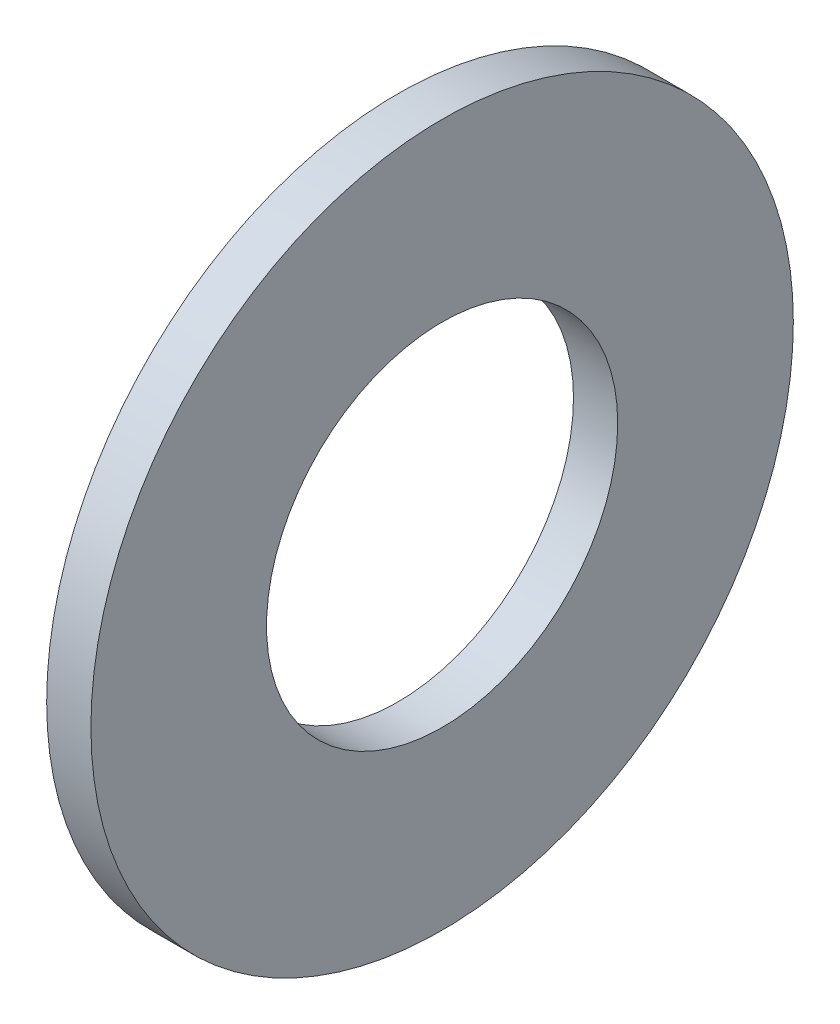
ISO-10303-21;
HEADER;
FILE_DESCRIPTION(('STEP AP214'),'2;1');
FILE_NAME('part.step','',(''),(''),'','','');
FILE_SCHEMA(('AUTOMOTIVE_DESIGN { 1 0 10303 214 1 1 1 1 }'));
ENDSEC;
DATA;
#1=APPLICATION_CONTEXT('core data for automotive mechanical design processes');
#2=APPLICATION_PROTOCOL_DEFINITION('international standard','automotive_design',2000,#1);
#3=PRODUCT_CONTEXT('',#1,'mechanical');
#4=PRODUCT('Part','Part','',(#3));
#5=PRODUCT_RELATED_PRODUCT_CATEGORY('part','',(#4));
#6=PRODUCT_DEFINITION_FORMATION('','',#4);
#7=PRODUCT_DEFINITION_CONTEXT('part definition',#1,'design');
#8=PRODUCT_DEFINITION('design','',#6,#7);
#9=PRODUCT_DEFINITION_SHAPE('','',#8);
#10=(LENGTH_UNIT() NAMED_UNIT(*) SI_UNIT(.MILLI.,.METRE.));
#11=(NAMED_UNIT(*) PLANE_ANGLE_UNIT() SI_UNIT($,.RADIAN.));
#12=(NAMED_UNIT(*) SI_UNIT($,.STERADIAN.) SOLID_ANGLE_UNIT());
#13=UNCERTAINTY_MEASURE_WITH_UNIT(LENGTH_MEASURE(1.E-05),#10,'distance_accuracy_value','');
#14=(GEOMETRIC_REPRESENTATION_CONTEXT(3) GLOBAL_UNCERTAINTY_ASSIGNED_CONTEXT((#13)) GLOBAL_UNIT_ASSIGNED_CONTEXT((#10,
#11,#12)) REPRESENTATION_CONTEXT('',''));
#15=CARTESIAN_POINT('',(0.,0.,0.));
#16=DIRECTION('',(0.,0.,1.));
#17=DIRECTION('',(1.,0.,0.));
#18=AXIS2_PLACEMENT_3D('',#15,#16,#17);
#19=CARTESIAN_POINT('',(0.8,0.,0.));
#20=DIRECTION('',(1.,0.,0.));
#21=DIRECTION('',(0.,0.,-1.));
#22=AXIS2_PLACEMENT_3D('',#19,#20,#21);
#23=PLANE('',#22);
#24=CARTESIAN_POINT('',(0.8,0.,0.));
#25=DIRECTION('',(1.,0.,0.));
#26=DIRECTION('',(0.,0.,-1.));
#27=AXIS2_PLACEMENT_3D('',#24,#25,#26);
#28=CIRCLE('',#27,6.35);
#29=CARTESIAN_POINT('',(0.8,0.,-6.35));
#30=VERTEX_POINT('',#29);
#31=EDGE_CURVE('E10',#30,#30,#28,.T.);
#32=ORIENTED_EDGE('',*,*,#31,.T.);
#33=EDGE_LOOP('',(#32));
#34=FACE_BOUND('',#33,.T.);
#35=CARTESIAN_POINT('',(0.8,0.,0.));
#36=DIRECTION('',(1.,0.,0.));
#37=DIRECTION('',(0.,0.,-1.));
#38=AXIS2_PLACEMENT_3D('',#35,#36,#37);
#39=CIRCLE('',#38,3.175);
#40=CARTESIAN_POINT('',(0.8,0.,-3.175));
#41=VERTEX_POINT('',#40);
#42=EDGE_CURVE('E42',#41,#41,#39,.T.);
#43=ORIENTED_EDGE('',*,*,#42,.F.);
#44=EDGE_LOOP('',(#43));
#45=FACE_BOUND('',#44,.T.);
#46=ADVANCED_FACE('F31',(#34,#45),#23,.T.);
#47=CARTESIAN_POINT('',(0.,0.,0.));
#48=DIRECTION('',(1.,0.,0.));
#49=DIRECTION('',(0.,0.,-1.));
#50=AXIS2_PLACEMENT_3D('',#47,#48,#49);
#51=PLANE('',#50);
#52=CARTESIAN_POINT('',(0.,0.,0.));
#53=DIRECTION('',(1.,0.,0.));
#54=DIRECTION('',(0.,0.,-1.));
#55=AXIS2_PLACEMENT_3D('',#52,#53,#54);
#56=CIRCLE('',#55,6.35);
#57=CARTESIAN_POINT('',(0.,0.,-6.35));
#58=VERTEX_POINT('',#57);
#59=EDGE_CURVE('E35',#58,#58,#56,.T.);
#60=ORIENTED_EDGE('',*,*,#59,.F.);
#61=EDGE_LOOP('',(#60));
#62=FACE_BOUND('',#61,.T.);
#63=CARTESIAN_POINT('',(0.,0.,0.));
#64=DIRECTION('',(1.,0.,0.));
#65=DIRECTION('',(0.,0.,-1.));
#66=AXIS2_PLACEMENT_3D('',#63,#64,#65);
#67=CIRCLE('',#66,3.175);
#68=CARTESIAN_POINT('',(0.,0.,-3.175));
#69=VERTEX_POINT('',#68);
#70=EDGE_CURVE('E44',#69,#69,#67,.T.);
#71=ORIENTED_EDGE('',*,*,#70,.T.);
#72=EDGE_LOOP('',(#71));
#73=FACE_BOUND('',#72,.T.);
#74=ADVANCED_FACE('F54',(#62,#73),#51,.F.);
#75=CARTESIAN_POINT('',(0.8,0.,0.));
#76=DIRECTION('',(-1.,0.,0.));
#77=DIRECTION('',(0.,0.,1.));
#78=AXIS2_PLACEMENT_3D('',#75,#76,#77);
#79=CYLINDRICAL_SURFACE('',#78,6.35);
#80=ORIENTED_EDGE('',*,*,#31,.F.);
#81=EDGE_LOOP('',(#80));
#82=FACE_BOUND('',#81,.T.);
#83=ORIENTED_EDGE('',*,*,#59,.T.);
#84=EDGE_LOOP('',(#83));
#85=FACE_BOUND('',#84,.T.);
#86=ADVANCED_FACE('F33',(#82,#85),#79,.T.);
#87=CARTESIAN_POINT('',(0.8,0.,0.));
#88=DIRECTION('',(-1.,0.,0.));
#89=DIRECTION('',(0.,0.,1.));
#90=AXIS2_PLACEMENT_3D('',#87,#88,#89);
#91=CYLINDRICAL_SURFACE('',#90,3.175);
#92=ORIENTED_EDGE('',*,*,#42,.T.);
#93=EDGE_LOOP('',(#92));
#94=FACE_BOUND('',#93,.T.);
#95=ORIENTED_EDGE('',*,*,#70,.F.);
#96=EDGE_LOOP('',(#95));
#97=FACE_BOUND('',#96,.T.);
#98=ADVANCED_FACE('F50',(#94,#97),#91,.F.);
#99=CLOSED_SHELL('',(#46,#74,#86,#98));
#100=MANIFOLD_SOLID_BREP('B2',#99);
#101=ADVANCED_BREP_SHAPE_REPRESENTATION('',(#18,#100),#14);
#102=SHAPE_DEFINITION_REPRESENTATION(#9,#101);
ENDSEC;
END-ISO-10303-21;
